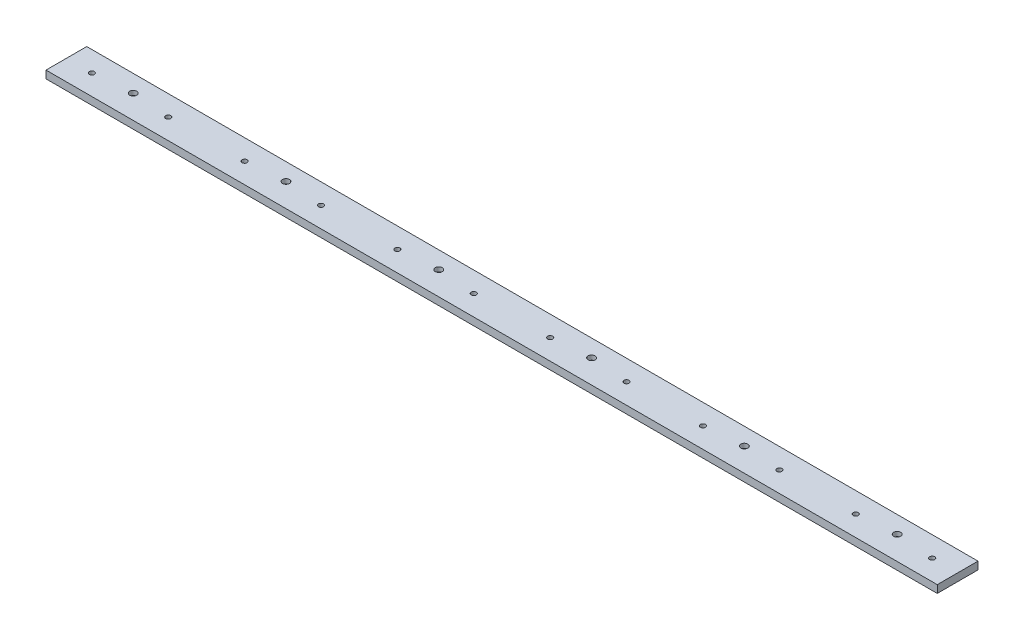
ISO-10303-21;
HEADER;
FILE_DESCRIPTION(('STEP AP214'),'2;1');
FILE_NAME('part.step','',(''),(''),'','','');
FILE_SCHEMA(('AUTOMOTIVE_DESIGN { 1 0 10303 214 1 1 1 1 }'));
ENDSEC;
DATA;
#1=APPLICATION_CONTEXT('core data for automotive mechanical design processes');
#2=APPLICATION_PROTOCOL_DEFINITION('international standard','automotive_design',2000,#1);
#3=PRODUCT_CONTEXT('',#1,'mechanical');
#4=PRODUCT('Part','Part','',(#3));
#5=PRODUCT_RELATED_PRODUCT_CATEGORY('part','',(#4));
#6=PRODUCT_DEFINITION_FORMATION('','',#4);
#7=PRODUCT_DEFINITION_CONTEXT('part definition',#1,'design');
#8=PRODUCT_DEFINITION('design','',#6,#7);
#9=PRODUCT_DEFINITION_SHAPE('','',#8);
#10=(LENGTH_UNIT() NAMED_UNIT(*) SI_UNIT(.MILLI.,.METRE.));
#11=(NAMED_UNIT(*) PLANE_ANGLE_UNIT() SI_UNIT($,.RADIAN.));
#12=(NAMED_UNIT(*) SI_UNIT($,.STERADIAN.) SOLID_ANGLE_UNIT());
#13=UNCERTAINTY_MEASURE_WITH_UNIT(LENGTH_MEASURE(1.E-05),#10,'distance_accuracy_value','');
#14=(GEOMETRIC_REPRESENTATION_CONTEXT(3) GLOBAL_UNCERTAINTY_ASSIGNED_CONTEXT((#13)) GLOBAL_UNIT_ASSIGNED_CONTEXT((#10,
#11,#12)) REPRESENTATION_CONTEXT('',''));
#15=CARTESIAN_POINT('',(0.,0.,0.));
#16=DIRECTION('',(0.,0.,1.));
#17=DIRECTION('',(1.,0.,0.));
#18=AXIS2_PLACEMENT_3D('',#15,#16,#17);
#19=CARTESIAN_POINT('',(50.,0.0325000000884756,13.5));
#20=DIRECTION('',(0.,-1.,0.));
#21=DIRECTION('',(0.,0.,-1.));
#22=AXIS2_PLACEMENT_3D('',#19,#20,#21);
#23=CONICAL_SURFACE('',#22,5.19999999989977,0.785398163409049);
#24=CARTESIAN_POINT('',(50.,2.4825,13.5));
#25=DIRECTION('',(0.,-1.,0.));
#26=DIRECTION('',(0.,0.,-1.));
#27=AXIS2_PLACEMENT_3D('',#24,#25,#26);
#28=CIRCLE('',#27,2.75);
#29=CARTESIAN_POINT('',(50.,2.4825,10.75));
#30=VERTEX_POINT('',#29);
#31=EDGE_CURVE('E331',#30,#30,#28,.F.);
#32=ORIENTED_EDGE('',*,*,#31,.T.);
#33=EDGE_LOOP('',(#32));
#34=FACE_BOUND('',#33,.T.);
#35=CARTESIAN_POINT('',(50.,0.0325000000429981,13.5));
#36=DIRECTION('',(0.,-1.,0.));
#37=DIRECTION('',(0.,0.,-1.));
#38=AXIS2_PLACEMENT_3D('',#35,#36,#37);
#39=CIRCLE('',#38,5.19999999994525);
#40=CARTESIAN_POINT('',(50.,0.0325000000429981,8.30000000005475));
#41=VERTEX_POINT('',#40);
#42=EDGE_CURVE('E19',#41,#41,#39,.F.);
#43=ORIENTED_EDGE('',*,*,#42,.F.);
#44=EDGE_LOOP('',(#43));
#45=FACE_BOUND('',#44,.T.);
#46=ADVANCED_FACE('F16',(#34,#45),#23,.F.);
#47=CARTESIAN_POINT('',(170.,0.0325000000884756,13.5));
#48=DIRECTION('',(0.,-1.,0.));
#49=DIRECTION('',(0.,0.,-1.));
#50=AXIS2_PLACEMENT_3D('',#47,#48,#49);
#51=CONICAL_SURFACE('',#50,5.19999999996115,0.785398163409049);
#52=CARTESIAN_POINT('',(170.,2.4825,13.5));
#53=DIRECTION('',(0.,-1.,0.));
#54=DIRECTION('',(0.,0.,-1.));
#55=AXIS2_PLACEMENT_3D('',#52,#53,#54);
#56=CIRCLE('',#55,2.75);
#57=CARTESIAN_POINT('',(170.,2.4825,10.75));
#58=VERTEX_POINT('',#57);
#59=EDGE_CURVE('E325',#58,#58,#56,.F.);
#60=ORIENTED_EDGE('',*,*,#59,.T.);
#61=EDGE_LOOP('',(#60));
#62=FACE_BOUND('',#61,.T.);
#63=CARTESIAN_POINT('',(170.,0.0325000000475362,13.5));
#64=DIRECTION('',(0.,-1.,0.));
#65=DIRECTION('',(0.,0.,-1.));
#66=AXIS2_PLACEMENT_3D('',#63,#64,#65);
#67=CIRCLE('',#66,5.20000000000209);
#68=CARTESIAN_POINT('',(170.,0.0325000000475362,8.29999999999791));
#69=VERTEX_POINT('',#68);
#70=EDGE_CURVE('E179',#69,#69,#67,.F.);
#71=ORIENTED_EDGE('',*,*,#70,.F.);
#72=EDGE_LOOP('',(#71));
#73=FACE_BOUND('',#72,.T.);
#74=ADVANCED_FACE('F188',(#62,#73),#51,.F.);
#75=CARTESIAN_POINT('',(290.,0.0325000001453191,13.5));
#76=DIRECTION('',(0.,-1.,0.));
#77=DIRECTION('',(0.,0.,-1.));
#78=AXIS2_PLACEMENT_3D('',#75,#76,#77);
#79=CONICAL_SURFACE('',#78,5.19999999985204,0.785398163397448);
#80=CARTESIAN_POINT('',(290.,2.4825,13.5));
#81=DIRECTION('',(0.,-1.,0.));
#82=DIRECTION('',(0.,0.,-1.));
#83=AXIS2_PLACEMENT_3D('',#80,#81,#82);
#84=CIRCLE('',#83,2.75);
#85=CARTESIAN_POINT('',(290.,2.4825,10.75));
#86=VERTEX_POINT('',#85);
#87=EDGE_CURVE('E311',#86,#86,#84,.F.);
#88=ORIENTED_EDGE('',*,*,#87,.T.);
#89=EDGE_LOOP('',(#88));
#90=FACE_BOUND('',#89,.T.);
#91=CARTESIAN_POINT('',(290.,0.0325000000521158,13.5));
#92=DIRECTION('',(0.,-1.,0.));
#93=DIRECTION('',(0.,0.,-1.));
#94=AXIS2_PLACEMENT_3D('',#91,#92,#93);
#95=CIRCLE('',#94,5.19999999994525);
#96=CARTESIAN_POINT('',(290.,0.0325000000521158,8.30000000005475));
#97=VERTEX_POINT('',#96);
#98=EDGE_CURVE('E177',#97,#97,#95,.F.);
#99=ORIENTED_EDGE('',*,*,#98,.F.);
#100=EDGE_LOOP('',(#99));
#101=FACE_BOUND('',#100,.T.);
#102=ADVANCED_FACE('F194',(#90,#101),#79,.F.);
#103=CARTESIAN_POINT('',(410.,0.0325000000316322,13.5));
#104=DIRECTION('',(0.,-1.,0.));
#105=DIRECTION('',(0.,0.,-1.));
#106=AXIS2_PLACEMENT_3D('',#103,#104,#105);
#107=CONICAL_SURFACE('',#106,5.19999999991339,0.785398163397448);
#108=CARTESIAN_POINT('',(410.,2.4825,13.5));
#109=DIRECTION('',(0.,-1.,0.));
#110=DIRECTION('',(0.,0.,-1.));
#111=AXIS2_PLACEMENT_3D('',#108,#109,#110);
#112=CIRCLE('',#111,2.75);
#113=CARTESIAN_POINT('',(410.,2.4825,10.75));
#114=VERTEX_POINT('',#113);
#115=EDGE_CURVE('E324',#114,#114,#112,.F.);
#116=ORIENTED_EDGE('',*,*,#115,.T.);
#117=EDGE_LOOP('',(#116));
#118=FACE_BOUND('',#117,.T.);
#119=CARTESIAN_POINT('',(410.,0.0324999999429254,13.5));
#120=DIRECTION('',(0.,-1.,0.));
#121=DIRECTION('',(0.,0.,-1.));
#122=AXIS2_PLACEMENT_3D('',#119,#120,#121);
#123=CIRCLE('',#122,5.20000000000209);
#124=CARTESIAN_POINT('',(410.,0.0324999999429254,8.29999999999791));
#125=VERTEX_POINT('',#124);
#126=EDGE_CURVE('E174',#125,#125,#123,.F.);
#127=ORIENTED_EDGE('',*,*,#126,.F.);
#128=EDGE_LOOP('',(#127));
#129=FACE_BOUND('',#128,.T.);
#130=ADVANCED_FACE('F299',(#118,#129),#107,.F.);
#131=CARTESIAN_POINT('',(530.,0.0325000000884756,13.5));
#132=DIRECTION('',(0.,-1.,0.));
#133=DIRECTION('',(0.,0.,-1.));
#134=AXIS2_PLACEMENT_3D('',#131,#132,#133);
#135=CONICAL_SURFACE('',#134,5.19999999997478,0.785398163397448);
#136=CARTESIAN_POINT('',(530.,2.4825,13.5));
#137=DIRECTION('',(0.,-1.,0.));
#138=DIRECTION('',(0.,0.,-1.));
#139=AXIS2_PLACEMENT_3D('',#136,#137,#138);
#140=CIRCLE('',#139,2.75);
#141=CARTESIAN_POINT('',(530.,2.4825,10.75));
#142=VERTEX_POINT('',#141);
#143=EDGE_CURVE('E328',#142,#142,#140,.F.);
#144=ORIENTED_EDGE('',*,*,#143,.T.);
#145=EDGE_LOOP('',(#144));
#146=FACE_BOUND('',#145,.T.);
#147=CARTESIAN_POINT('',(530.,0.0325000000043207,13.5));
#148=DIRECTION('',(0.,-1.,0.));
#149=DIRECTION('',(0.,0.,-1.));
#150=AXIS2_PLACEMENT_3D('',#147,#148,#149);
#151=CIRCLE('',#150,5.20000000005894);
#152=CARTESIAN_POINT('',(530.,0.0325000000043207,8.29999999994106));
#153=VERTEX_POINT('',#152);
#154=EDGE_CURVE('E171',#153,#153,#151,.F.);
#155=ORIENTED_EDGE('',*,*,#154,.F.);
#156=EDGE_LOOP('',(#155));
#157=FACE_BOUND('',#156,.T.);
#158=ADVANCED_FACE('F295',(#146,#157),#135,.F.);
#159=CARTESIAN_POINT('',(650.,0.0325000000316322,13.5));
#160=DIRECTION('',(0.,-1.,0.));
#161=DIRECTION('',(0.,0.,-1.));
#162=AXIS2_PLACEMENT_3D('',#159,#160,#161);
#163=CONICAL_SURFACE('',#162,5.19999999997933,0.785398163397448);
#164=CARTESIAN_POINT('',(650.,2.4825,13.5));
#165=DIRECTION('',(0.,-1.,0.));
#166=DIRECTION('',(0.,0.,-1.));
#167=AXIS2_PLACEMENT_3D('',#164,#165,#166);
#168=CIRCLE('',#167,2.75);
#169=CARTESIAN_POINT('',(650.,2.4825,10.75));
#170=VERTEX_POINT('',#169);
#171=EDGE_CURVE('E168',#170,#170,#168,.F.);
#172=ORIENTED_EDGE('',*,*,#171,.T.);
#173=EDGE_LOOP('',(#172));
#174=FACE_BOUND('',#173,.T.);
#175=CARTESIAN_POINT('',(650.,0.0325000000088727,13.5));
#176=DIRECTION('',(0.,-1.,0.));
#177=DIRECTION('',(0.,0.,-1.));
#178=AXIS2_PLACEMENT_3D('',#175,#176,#177);
#179=CIRCLE('',#178,5.20000000000209);
#180=CARTESIAN_POINT('',(650.,0.0325000000088727,8.29999999999791));
#181=VERTEX_POINT('',#180);
#182=EDGE_CURVE('E66',#181,#181,#179,.F.);
#183=ORIENTED_EDGE('',*,*,#182,.F.);
#184=EDGE_LOOP('',(#183));
#185=FACE_BOUND('',#184,.T.);
#186=ADVANCED_FACE('F291',(#174,#185),#163,.F.);
#187=CARTESIAN_POINT('',(0.,0.03250000000003,0.));
#188=DIRECTION('',(0.,-1.,0.));
#189=DIRECTION('',(0.,0.,-1.));
#190=AXIS2_PLACEMENT_3D('',#187,#188,#189);
#191=PLANE('',#190);
#192=CARTESIAN_POINT('',(680.,0.0325000000000299,16.));
#193=DIRECTION('',(0.,-1.,0.));
#194=DIRECTION('',(0.,0.,-1.));
#195=AXIS2_PLACEMENT_3D('',#192,#193,#194);
#196=CIRCLE('',#195,2.);
#197=CARTESIAN_POINT('',(680.,0.0325000000000299,14.));
#198=VERTEX_POINT('',#197);
#199=EDGE_CURVE('E132',#198,#198,#196,.F.);
#200=ORIENTED_EDGE('',*,*,#199,.T.);
#201=EDGE_LOOP('',(#200));
#202=FACE_BOUND('',#201,.T.);
#203=CARTESIAN_POINT('',(620.,0.0325000000000299,16.));
#204=DIRECTION('',(0.,-1.,0.));
#205=DIRECTION('',(0.,0.,-1.));
#206=AXIS2_PLACEMENT_3D('',#203,#204,#205);
#207=CIRCLE('',#206,2.);
#208=CARTESIAN_POINT('',(620.,0.0325000000000299,14.));
#209=VERTEX_POINT('',#208);
#210=EDGE_CURVE('E135',#209,#209,#207,.F.);
#211=ORIENTED_EDGE('',*,*,#210,.T.);
#212=EDGE_LOOP('',(#211));
#213=FACE_BOUND('',#212,.T.);
#214=CARTESIAN_POINT('',(560.,0.0325000000000299,16.));
#215=DIRECTION('',(0.,-1.,0.));
#216=DIRECTION('',(0.,0.,-1.));
#217=AXIS2_PLACEMENT_3D('',#214,#215,#216);
#218=CIRCLE('',#217,2.);
#219=CARTESIAN_POINT('',(560.,0.0325000000000299,14.));
#220=VERTEX_POINT('',#219);
#221=EDGE_CURVE('E138',#220,#220,#218,.F.);
#222=ORIENTED_EDGE('',*,*,#221,.T.);
#223=EDGE_LOOP('',(#222));
#224=FACE_BOUND('',#223,.T.);
#225=ORIENTED_EDGE('',*,*,#182,.T.);
#226=EDGE_LOOP('',(#225));
#227=FACE_BOUND('',#226,.T.);
#228=ORIENTED_EDGE('',*,*,#154,.T.);
#229=EDGE_LOOP('',(#228));
#230=FACE_BOUND('',#229,.T.);
#231=CARTESIAN_POINT('',(500.,0.0325000000000299,16.));
#232=DIRECTION('',(0.,-1.,0.));
#233=DIRECTION('',(0.,0.,-1.));
#234=AXIS2_PLACEMENT_3D('',#231,#232,#233);
#235=CIRCLE('',#234,2.);
#236=CARTESIAN_POINT('',(500.,0.0325000000000299,14.));
#237=VERTEX_POINT('',#236);
#238=EDGE_CURVE('E141',#237,#237,#235,.F.);
#239=ORIENTED_EDGE('',*,*,#238,.T.);
#240=EDGE_LOOP('',(#239));
#241=FACE_BOUND('',#240,.T.);
#242=CARTESIAN_POINT('',(440.,0.0325000000000299,16.));
#243=DIRECTION('',(0.,-1.,0.));
#244=DIRECTION('',(0.,0.,-1.));
#245=AXIS2_PLACEMENT_3D('',#242,#243,#244);
#246=CIRCLE('',#245,2.);
#247=CARTESIAN_POINT('',(440.,0.0325000000000299,14.));
#248=VERTEX_POINT('',#247);
#249=EDGE_CURVE('E144',#248,#248,#246,.F.);
#250=ORIENTED_EDGE('',*,*,#249,.T.);
#251=EDGE_LOOP('',(#250));
#252=FACE_BOUND('',#251,.T.);
#253=CARTESIAN_POINT('',(380.,0.0325000000000299,16.));
#254=DIRECTION('',(0.,-1.,0.));
#255=DIRECTION('',(0.,0.,-1.));
#256=AXIS2_PLACEMENT_3D('',#253,#254,#255);
#257=CIRCLE('',#256,2.);
#258=CARTESIAN_POINT('',(380.,0.0325000000000299,14.));
#259=VERTEX_POINT('',#258);
#260=EDGE_CURVE('E147',#259,#259,#257,.F.);
#261=ORIENTED_EDGE('',*,*,#260,.T.);
#262=EDGE_LOOP('',(#261));
#263=FACE_BOUND('',#262,.T.);
#264=ORIENTED_EDGE('',*,*,#126,.T.);
#265=EDGE_LOOP('',(#264));
#266=FACE_BOUND('',#265,.T.);
#267=CARTESIAN_POINT('',(320.,0.0325000000000299,16.));
#268=DIRECTION('',(0.,-1.,0.));
#269=DIRECTION('',(0.,0.,-1.));
#270=AXIS2_PLACEMENT_3D('',#267,#268,#269);
#271=CIRCLE('',#270,2.);
#272=CARTESIAN_POINT('',(320.,0.0325000000000299,14.));
#273=VERTEX_POINT('',#272);
#274=EDGE_CURVE('E150',#273,#273,#271,.F.);
#275=ORIENTED_EDGE('',*,*,#274,.T.);
#276=EDGE_LOOP('',(#275));
#277=FACE_BOUND('',#276,.T.);
#278=CARTESIAN_POINT('',(260.,0.0325000000000299,16.));
#279=DIRECTION('',(0.,-1.,0.));
#280=DIRECTION('',(0.,0.,-1.));
#281=AXIS2_PLACEMENT_3D('',#278,#279,#280);
#282=CIRCLE('',#281,2.);
#283=CARTESIAN_POINT('',(260.,0.0325000000000299,14.));
#284=VERTEX_POINT('',#283);
#285=EDGE_CURVE('E153',#284,#284,#282,.F.);
#286=ORIENTED_EDGE('',*,*,#285,.T.);
#287=EDGE_LOOP('',(#286));
#288=FACE_BOUND('',#287,.T.);
#289=CARTESIAN_POINT('',(200.,0.0325000000000299,16.));
#290=DIRECTION('',(0.,-1.,0.));
#291=DIRECTION('',(0.,0.,-1.));
#292=AXIS2_PLACEMENT_3D('',#289,#290,#291);
#293=CIRCLE('',#292,2.);
#294=CARTESIAN_POINT('',(200.,0.0325000000000299,14.));
#295=VERTEX_POINT('',#294);
#296=EDGE_CURVE('E156',#295,#295,#293,.F.);
#297=ORIENTED_EDGE('',*,*,#296,.T.);
#298=EDGE_LOOP('',(#297));
#299=FACE_BOUND('',#298,.T.);
#300=ORIENTED_EDGE('',*,*,#98,.T.);
#301=EDGE_LOOP('',(#300));
#302=FACE_BOUND('',#301,.T.);
#303=CARTESIAN_POINT('',(140.,0.0325000000000299,16.));
#304=DIRECTION('',(0.,-1.,0.));
#305=DIRECTION('',(0.,0.,-1.));
#306=AXIS2_PLACEMENT_3D('',#303,#304,#305);
#307=CIRCLE('',#306,2.);
#308=CARTESIAN_POINT('',(140.,0.0325000000000299,14.));
#309=VERTEX_POINT('',#308);
#310=EDGE_CURVE('E159',#309,#309,#307,.F.);
#311=ORIENTED_EDGE('',*,*,#310,.T.);
#312=EDGE_LOOP('',(#311));
#313=FACE_BOUND('',#312,.T.);
#314=CARTESIAN_POINT('',(80.,0.0325000000000299,16.));
#315=DIRECTION('',(0.,-1.,0.));
#316=DIRECTION('',(0.,0.,-1.));
#317=AXIS2_PLACEMENT_3D('',#314,#315,#316);
#318=CIRCLE('',#317,2.);
#319=CARTESIAN_POINT('',(80.,0.0325000000000299,14.));
#320=VERTEX_POINT('',#319);
#321=EDGE_CURVE('E162',#320,#320,#318,.F.);
#322=ORIENTED_EDGE('',*,*,#321,.T.);
#323=EDGE_LOOP('',(#322));
#324=FACE_BOUND('',#323,.T.);
#325=CARTESIAN_POINT('',(20.,0.0325000000000299,16.));
#326=DIRECTION('',(0.,-1.,0.));
#327=DIRECTION('',(0.,0.,-1.));
#328=AXIS2_PLACEMENT_3D('',#325,#326,#327);
#329=CIRCLE('',#328,2.);
#330=CARTESIAN_POINT('',(20.,0.0325000000000299,14.));
#331=VERTEX_POINT('',#330);
#332=EDGE_CURVE('E165',#331,#331,#329,.F.);
#333=ORIENTED_EDGE('',*,*,#332,.T.);
#334=EDGE_LOOP('',(#333));
#335=FACE_BOUND('',#334,.T.);
#336=ORIENTED_EDGE('',*,*,#70,.T.);
#337=EDGE_LOOP('',(#336));
#338=FACE_BOUND('',#337,.T.);
#339=ORIENTED_EDGE('',*,*,#42,.T.);
#340=EDGE_LOOP('',(#339));
#341=FACE_BOUND('',#340,.T.);
#342=DIRECTION('',(0.,0.,-1.));
#343=VECTOR('',#342,1.);
#344=CARTESIAN_POINT('',(700.,0.0325000000000299,0.));
#345=LINE('',#344,#343);
#346=CARTESIAN_POINT('',(700.,0.0325000000000299,32.));
#347=VERTEX_POINT('',#346);
#348=CARTESIAN_POINT('',(700.,0.0325000000000299,0.));
#349=VERTEX_POINT('',#348);
#350=EDGE_CURVE('E340',#347,#349,#345,.T.);
#351=ORIENTED_EDGE('',*,*,#350,.F.);
#352=DIRECTION('',(1.,0.,0.));
#353=VECTOR('',#352,1.);
#354=CARTESIAN_POINT('',(0.,0.0325000000000299,32.));
#355=LINE('',#354,#353);
#356=CARTESIAN_POINT('',(0.,0.0325000000000299,32.));
#357=VERTEX_POINT('',#356);
#358=EDGE_CURVE('E60',#357,#347,#355,.T.);
#359=ORIENTED_EDGE('',*,*,#358,.F.);
#360=DIRECTION('',(0.,0.,-1.));
#361=VECTOR('',#360,1.);
#362=CARTESIAN_POINT('',(0.,0.0325000000000299,0.));
#363=LINE('',#362,#361);
#364=CARTESIAN_POINT('',(0.,0.0325000000000299,0.));
#365=VERTEX_POINT('',#364);
#366=EDGE_CURVE('E58',#357,#365,#363,.T.);
#367=ORIENTED_EDGE('',*,*,#366,.T.);
#368=DIRECTION('',(1.,0.,0.));
#369=VECTOR('',#368,1.);
#370=CARTESIAN_POINT('',(0.,0.0325000000000299,0.));
#371=LINE('',#370,#369);
#372=EDGE_CURVE('E55',#365,#349,#371,.T.);
#373=ORIENTED_EDGE('',*,*,#372,.T.);
#374=EDGE_LOOP('',(#351,#359,#367,#373));
#375=FACE_BOUND('',#374,.T.);
#376=ADVANCED_FACE('F59',(#202,#213,#224,#227,#230,#241,#252,#263,#266,#277,#288,#299,#302,#313,
#324,#335,#338,#341,#375),#191,.T.);
#377=CARTESIAN_POINT('',(0.,6.0325,0.));
#378=DIRECTION('',(1.,0.,0.));
#379=DIRECTION('',(0.,0.,-1.));
#380=AXIS2_PLACEMENT_3D('',#377,#378,#379);
#381=PLANE('',#380);
#382=DIRECTION('',(0.,1.,0.));
#383=VECTOR('',#382,1.);
#384=CARTESIAN_POINT('',(0.,6.0325,32.));
#385=LINE('',#384,#383);
#386=CARTESIAN_POINT('',(0.,6.0325,32.));
#387=VERTEX_POINT('',#386);
#388=EDGE_CURVE('E338',#387,#357,#385,.F.);
#389=ORIENTED_EDGE('',*,*,#388,.F.);
#390=DIRECTION('',(0.,0.,-1.));
#391=VECTOR('',#390,1.);
#392=CARTESIAN_POINT('',(0.,6.0325,0.));
#393=LINE('',#392,#391);
#394=CARTESIAN_POINT('',(0.,6.0325,0.));
#395=VERTEX_POINT('',#394);
#396=EDGE_CURVE('E77',#387,#395,#393,.T.);
#397=ORIENTED_EDGE('',*,*,#396,.T.);
#398=DIRECTION('',(0.,1.,0.));
#399=VECTOR('',#398,1.);
#400=CARTESIAN_POINT('',(0.,6.0325,0.));
#401=LINE('',#400,#399);
#402=EDGE_CURVE('E65',#395,#365,#401,.F.);
#403=ORIENTED_EDGE('',*,*,#402,.T.);
#404=ORIENTED_EDGE('',*,*,#366,.F.);
#405=EDGE_LOOP('',(#389,#397,#403,#404));
#406=FACE_BOUND('',#405,.T.);
#407=ADVANCED_FACE('F76',(#406),#381,.F.);
#408=CARTESIAN_POINT('',(0.,6.0325,0.));
#409=DIRECTION('',(0.,0.,1.));
#410=DIRECTION('',(1.,0.,0.));
#411=AXIS2_PLACEMENT_3D('',#408,#409,#410);
#412=PLANE('',#411);
#413=ORIENTED_EDGE('',*,*,#372,.F.);
#414=ORIENTED_EDGE('',*,*,#402,.F.);
#415=DIRECTION('',(1.,0.,0.));
#416=VECTOR('',#415,1.);
#417=CARTESIAN_POINT('',(0.,6.0325,0.));
#418=LINE('',#417,#416);
#419=CARTESIAN_POINT('',(700.,6.0325,0.));
#420=VERTEX_POINT('',#419);
#421=EDGE_CURVE('E345',#395,#420,#418,.T.);
#422=ORIENTED_EDGE('',*,*,#421,.T.);
#423=DIRECTION('',(0.,1.,0.));
#424=VECTOR('',#423,1.);
#425=CARTESIAN_POINT('',(700.,6.0325,0.));
#426=LINE('',#425,#424);
#427=EDGE_CURVE('E73',#349,#420,#426,.T.);
#428=ORIENTED_EDGE('',*,*,#427,.F.);
#429=EDGE_LOOP('',(#413,#414,#422,#428));
#430=FACE_BOUND('',#429,.T.);
#431=ADVANCED_FACE('F70',(#430),#412,.F.);
#432=CARTESIAN_POINT('',(700.,6.0325,0.));
#433=DIRECTION('',(1.,0.,0.));
#434=DIRECTION('',(0.,0.,-1.));
#435=AXIS2_PLACEMENT_3D('',#432,#433,#434);
#436=PLANE('',#435);
#437=DIRECTION('',(0.,1.,0.));
#438=VECTOR('',#437,1.);
#439=CARTESIAN_POINT('',(700.,6.0325,32.));
#440=LINE('',#439,#438);
#441=CARTESIAN_POINT('',(700.,6.0325,32.));
#442=VERTEX_POINT('',#441);
#443=EDGE_CURVE('E34',#347,#442,#440,.T.);
#444=ORIENTED_EDGE('',*,*,#443,.F.);
#445=ORIENTED_EDGE('',*,*,#350,.T.);
#446=ORIENTED_EDGE('',*,*,#427,.T.);
#447=DIRECTION('',(0.,0.,-1.));
#448=VECTOR('',#447,1.);
#449=CARTESIAN_POINT('',(700.,6.0325,0.));
#450=LINE('',#449,#448);
#451=EDGE_CURVE('E343',#420,#442,#450,.F.);
#452=ORIENTED_EDGE('',*,*,#451,.T.);
#453=EDGE_LOOP('',(#444,#445,#446,#452));
#454=FACE_BOUND('',#453,.T.);
#455=ADVANCED_FACE('F281',(#454),#436,.T.);
#456=CARTESIAN_POINT('',(0.,6.0325,32.));
#457=DIRECTION('',(0.,0.,1.));
#458=DIRECTION('',(1.,0.,0.));
#459=AXIS2_PLACEMENT_3D('',#456,#457,#458);
#460=PLANE('',#459);
#461=ORIENTED_EDGE('',*,*,#358,.T.);
#462=ORIENTED_EDGE('',*,*,#443,.T.);
#463=DIRECTION('',(1.,0.,0.));
#464=VECTOR('',#463,1.);
#465=CARTESIAN_POINT('',(0.,6.0325,32.));
#466=LINE('',#465,#464);
#467=EDGE_CURVE('E131',#442,#387,#466,.F.);
#468=ORIENTED_EDGE('',*,*,#467,.T.);
#469=ORIENTED_EDGE('',*,*,#388,.T.);
#470=EDGE_LOOP('',(#461,#462,#468,#469));
#471=FACE_BOUND('',#470,.T.);
#472=ADVANCED_FACE('F277',(#471),#460,.T.);
#473=CARTESIAN_POINT('',(50.,6.0325,13.5));
#474=DIRECTION('',(0.,-1.,0.));
#475=DIRECTION('',(0.,0.,-1.));
#476=AXIS2_PLACEMENT_3D('',#473,#474,#475);
#477=CYLINDRICAL_SURFACE('',#476,2.75);
#478=CARTESIAN_POINT('',(50.,6.0325,13.5));
#479=DIRECTION('',(0.,-1.,0.));
#480=DIRECTION('',(0.,0.,-1.));
#481=AXIS2_PLACEMENT_3D('',#478,#479,#480);
#482=CIRCLE('',#481,2.75);
#483=CARTESIAN_POINT('',(50.,6.0325,10.75));
#484=VERTEX_POINT('',#483);
#485=EDGE_CURVE('E128',#484,#484,#482,.F.);
#486=ORIENTED_EDGE('',*,*,#485,.T.);
#487=EDGE_LOOP('',(#486));
#488=FACE_BOUND('',#487,.T.);
#489=ORIENTED_EDGE('',*,*,#31,.F.);
#490=EDGE_LOOP('',(#489));
#491=FACE_BOUND('',#490,.T.);
#492=ADVANCED_FACE('F273',(#488,#491),#477,.F.);
#493=CARTESIAN_POINT('',(170.,6.0325,13.5));
#494=DIRECTION('',(0.,-1.,0.));
#495=DIRECTION('',(0.,0.,-1.));
#496=AXIS2_PLACEMENT_3D('',#493,#494,#495);
#497=CYLINDRICAL_SURFACE('',#496,2.75);
#498=CARTESIAN_POINT('',(170.,6.0325,13.5));
#499=DIRECTION('',(0.,-1.,0.));
#500=DIRECTION('',(0.,0.,-1.));
#501=AXIS2_PLACEMENT_3D('',#498,#499,#500);
#502=CIRCLE('',#501,2.75);
#503=CARTESIAN_POINT('',(170.,6.0325,10.75));
#504=VERTEX_POINT('',#503);
#505=EDGE_CURVE('E125',#504,#504,#502,.F.);
#506=ORIENTED_EDGE('',*,*,#505,.T.);
#507=EDGE_LOOP('',(#506));
#508=FACE_BOUND('',#507,.T.);
#509=ORIENTED_EDGE('',*,*,#59,.F.);
#510=EDGE_LOOP('',(#509));
#511=FACE_BOUND('',#510,.T.);
#512=ADVANCED_FACE('F269',(#508,#511),#497,.F.);
#513=CARTESIAN_POINT('',(290.,6.0325,13.5));
#514=DIRECTION('',(0.,-1.,0.));
#515=DIRECTION('',(0.,0.,-1.));
#516=AXIS2_PLACEMENT_3D('',#513,#514,#515);
#517=CYLINDRICAL_SURFACE('',#516,2.75);
#518=CARTESIAN_POINT('',(290.,6.0325,13.5));
#519=DIRECTION('',(0.,-1.,0.));
#520=DIRECTION('',(0.,0.,-1.));
#521=AXIS2_PLACEMENT_3D('',#518,#519,#520);
#522=CIRCLE('',#521,2.75);
#523=CARTESIAN_POINT('',(290.,6.0325,10.75));
#524=VERTEX_POINT('',#523);
#525=EDGE_CURVE('E122',#524,#524,#522,.F.);
#526=ORIENTED_EDGE('',*,*,#525,.T.);
#527=EDGE_LOOP('',(#526));
#528=FACE_BOUND('',#527,.T.);
#529=ORIENTED_EDGE('',*,*,#87,.F.);
#530=EDGE_LOOP('',(#529));
#531=FACE_BOUND('',#530,.T.);
#532=ADVANCED_FACE('F265',(#528,#531),#517,.F.);
#533=CARTESIAN_POINT('',(410.,6.0325,13.5));
#534=DIRECTION('',(0.,-1.,0.));
#535=DIRECTION('',(0.,0.,-1.));
#536=AXIS2_PLACEMENT_3D('',#533,#534,#535);
#537=CYLINDRICAL_SURFACE('',#536,2.75);
#538=CARTESIAN_POINT('',(410.,6.0325,13.5));
#539=DIRECTION('',(0.,-1.,0.));
#540=DIRECTION('',(0.,0.,-1.));
#541=AXIS2_PLACEMENT_3D('',#538,#539,#540);
#542=CIRCLE('',#541,2.75);
#543=CARTESIAN_POINT('',(410.,6.0325,10.75));
#544=VERTEX_POINT('',#543);
#545=EDGE_CURVE('E119',#544,#544,#542,.F.);
#546=ORIENTED_EDGE('',*,*,#545,.T.);
#547=EDGE_LOOP('',(#546));
#548=FACE_BOUND('',#547,.T.);
#549=ORIENTED_EDGE('',*,*,#115,.F.);
#550=EDGE_LOOP('',(#549));
#551=FACE_BOUND('',#550,.T.);
#552=ADVANCED_FACE('F261',(#548,#551),#537,.F.);
#553=CARTESIAN_POINT('',(530.,6.0325,13.5));
#554=DIRECTION('',(0.,-1.,0.));
#555=DIRECTION('',(0.,0.,-1.));
#556=AXIS2_PLACEMENT_3D('',#553,#554,#555);
#557=CYLINDRICAL_SURFACE('',#556,2.75);
#558=CARTESIAN_POINT('',(530.,6.0325,13.5));
#559=DIRECTION('',(0.,-1.,0.));
#560=DIRECTION('',(0.,0.,-1.));
#561=AXIS2_PLACEMENT_3D('',#558,#559,#560);
#562=CIRCLE('',#561,2.75);
#563=CARTESIAN_POINT('',(530.,6.0325,10.75));
#564=VERTEX_POINT('',#563);
#565=EDGE_CURVE('E116',#564,#564,#562,.F.);
#566=ORIENTED_EDGE('',*,*,#565,.T.);
#567=EDGE_LOOP('',(#566));
#568=FACE_BOUND('',#567,.T.);
#569=ORIENTED_EDGE('',*,*,#143,.F.);
#570=EDGE_LOOP('',(#569));
#571=FACE_BOUND('',#570,.T.);
#572=ADVANCED_FACE('F257',(#568,#571),#557,.F.);
#573=CARTESIAN_POINT('',(650.,6.0325,13.5));
#574=DIRECTION('',(0.,-1.,0.));
#575=DIRECTION('',(0.,0.,-1.));
#576=AXIS2_PLACEMENT_3D('',#573,#574,#575);
#577=CYLINDRICAL_SURFACE('',#576,2.75);
#578=CARTESIAN_POINT('',(650.,6.0325,13.5));
#579=DIRECTION('',(0.,-1.,0.));
#580=DIRECTION('',(0.,0.,-1.));
#581=AXIS2_PLACEMENT_3D('',#578,#579,#580);
#582=CIRCLE('',#581,2.75);
#583=CARTESIAN_POINT('',(650.,6.0325,10.75));
#584=VERTEX_POINT('',#583);
#585=EDGE_CURVE('E113',#584,#584,#582,.F.);
#586=ORIENTED_EDGE('',*,*,#585,.T.);
#587=EDGE_LOOP('',(#586));
#588=FACE_BOUND('',#587,.T.);
#589=ORIENTED_EDGE('',*,*,#171,.F.);
#590=EDGE_LOOP('',(#589));
#591=FACE_BOUND('',#590,.T.);
#592=ADVANCED_FACE('F253',(#588,#591),#577,.F.);
#593=CARTESIAN_POINT('',(20.,6.0325,16.));
#594=DIRECTION('',(0.,-1.,0.));
#595=DIRECTION('',(0.,0.,-1.));
#596=AXIS2_PLACEMENT_3D('',#593,#594,#595);
#597=CYLINDRICAL_SURFACE('',#596,2.);
#598=CARTESIAN_POINT('',(20.,6.0325,16.));
#599=DIRECTION('',(0.,-1.,0.));
#600=DIRECTION('',(0.,0.,-1.));
#601=AXIS2_PLACEMENT_3D('',#598,#599,#600);
#602=CIRCLE('',#601,2.);
#603=CARTESIAN_POINT('',(20.,6.0325,14.));
#604=VERTEX_POINT('',#603);
#605=EDGE_CURVE('E110',#604,#604,#602,.F.);
#606=ORIENTED_EDGE('',*,*,#605,.T.);
#607=EDGE_LOOP('',(#606));
#608=FACE_BOUND('',#607,.T.);
#609=ORIENTED_EDGE('',*,*,#332,.F.);
#610=EDGE_LOOP('',(#609));
#611=FACE_BOUND('',#610,.T.);
#612=ADVANCED_FACE('F249',(#608,#611),#597,.F.);
#613=CARTESIAN_POINT('',(80.,6.0325,16.));
#614=DIRECTION('',(0.,-1.,0.));
#615=DIRECTION('',(0.,0.,-1.));
#616=AXIS2_PLACEMENT_3D('',#613,#614,#615);
#617=CYLINDRICAL_SURFACE('',#616,2.);
#618=CARTESIAN_POINT('',(80.,6.0325,16.));
#619=DIRECTION('',(0.,-1.,0.));
#620=DIRECTION('',(0.,0.,-1.));
#621=AXIS2_PLACEMENT_3D('',#618,#619,#620);
#622=CIRCLE('',#621,2.);
#623=CARTESIAN_POINT('',(80.,6.0325,14.));
#624=VERTEX_POINT('',#623);
#625=EDGE_CURVE('E107',#624,#624,#622,.F.);
#626=ORIENTED_EDGE('',*,*,#625,.T.);
#627=EDGE_LOOP('',(#626));
#628=FACE_BOUND('',#627,.T.);
#629=ORIENTED_EDGE('',*,*,#321,.F.);
#630=EDGE_LOOP('',(#629));
#631=FACE_BOUND('',#630,.T.);
#632=ADVANCED_FACE('F245',(#628,#631),#617,.F.);
#633=CARTESIAN_POINT('',(140.,6.0325,16.));
#634=DIRECTION('',(0.,-1.,0.));
#635=DIRECTION('',(0.,0.,-1.));
#636=AXIS2_PLACEMENT_3D('',#633,#634,#635);
#637=CYLINDRICAL_SURFACE('',#636,2.);
#638=CARTESIAN_POINT('',(140.,6.0325,16.));
#639=DIRECTION('',(0.,-1.,0.));
#640=DIRECTION('',(0.,0.,-1.));
#641=AXIS2_PLACEMENT_3D('',#638,#639,#640);
#642=CIRCLE('',#641,2.);
#643=CARTESIAN_POINT('',(140.,6.0325,14.));
#644=VERTEX_POINT('',#643);
#645=EDGE_CURVE('E104',#644,#644,#642,.F.);
#646=ORIENTED_EDGE('',*,*,#645,.T.);
#647=EDGE_LOOP('',(#646));
#648=FACE_BOUND('',#647,.T.);
#649=ORIENTED_EDGE('',*,*,#310,.F.);
#650=EDGE_LOOP('',(#649));
#651=FACE_BOUND('',#650,.T.);
#652=ADVANCED_FACE('F241',(#648,#651),#637,.F.);
#653=CARTESIAN_POINT('',(200.,6.0325,16.));
#654=DIRECTION('',(0.,-1.,0.));
#655=DIRECTION('',(0.,0.,-1.));
#656=AXIS2_PLACEMENT_3D('',#653,#654,#655);
#657=CYLINDRICAL_SURFACE('',#656,2.);
#658=CARTESIAN_POINT('',(200.,6.0325,16.));
#659=DIRECTION('',(0.,-1.,0.));
#660=DIRECTION('',(0.,0.,-1.));
#661=AXIS2_PLACEMENT_3D('',#658,#659,#660);
#662=CIRCLE('',#661,2.);
#663=CARTESIAN_POINT('',(200.,6.0325,14.));
#664=VERTEX_POINT('',#663);
#665=EDGE_CURVE('E101',#664,#664,#662,.F.);
#666=ORIENTED_EDGE('',*,*,#665,.T.);
#667=EDGE_LOOP('',(#666));
#668=FACE_BOUND('',#667,.T.);
#669=ORIENTED_EDGE('',*,*,#296,.F.);
#670=EDGE_LOOP('',(#669));
#671=FACE_BOUND('',#670,.T.);
#672=ADVANCED_FACE('F237',(#668,#671),#657,.F.);
#673=CARTESIAN_POINT('',(260.,6.0325,16.));
#674=DIRECTION('',(0.,-1.,0.));
#675=DIRECTION('',(0.,0.,-1.));
#676=AXIS2_PLACEMENT_3D('',#673,#674,#675);
#677=CYLINDRICAL_SURFACE('',#676,2.);
#678=CARTESIAN_POINT('',(260.,6.0325,16.));
#679=DIRECTION('',(0.,-1.,0.));
#680=DIRECTION('',(0.,0.,-1.));
#681=AXIS2_PLACEMENT_3D('',#678,#679,#680);
#682=CIRCLE('',#681,2.);
#683=CARTESIAN_POINT('',(260.,6.0325,14.));
#684=VERTEX_POINT('',#683);
#685=EDGE_CURVE('E98',#684,#684,#682,.F.);
#686=ORIENTED_EDGE('',*,*,#685,.T.);
#687=EDGE_LOOP('',(#686));
#688=FACE_BOUND('',#687,.T.);
#689=ORIENTED_EDGE('',*,*,#285,.F.);
#690=EDGE_LOOP('',(#689));
#691=FACE_BOUND('',#690,.T.);
#692=ADVANCED_FACE('F233',(#688,#691),#677,.F.);
#693=CARTESIAN_POINT('',(320.,6.0325,16.));
#694=DIRECTION('',(0.,-1.,0.));
#695=DIRECTION('',(0.,0.,-1.));
#696=AXIS2_PLACEMENT_3D('',#693,#694,#695);
#697=CYLINDRICAL_SURFACE('',#696,2.);
#698=CARTESIAN_POINT('',(320.,6.0325,16.));
#699=DIRECTION('',(0.,-1.,0.));
#700=DIRECTION('',(0.,0.,-1.));
#701=AXIS2_PLACEMENT_3D('',#698,#699,#700);
#702=CIRCLE('',#701,2.);
#703=CARTESIAN_POINT('',(320.,6.0325,14.));
#704=VERTEX_POINT('',#703);
#705=EDGE_CURVE('E95',#704,#704,#702,.F.);
#706=ORIENTED_EDGE('',*,*,#705,.T.);
#707=EDGE_LOOP('',(#706));
#708=FACE_BOUND('',#707,.T.);
#709=ORIENTED_EDGE('',*,*,#274,.F.);
#710=EDGE_LOOP('',(#709));
#711=FACE_BOUND('',#710,.T.);
#712=ADVANCED_FACE('F229',(#708,#711),#697,.F.);
#713=CARTESIAN_POINT('',(380.,6.0325,16.));
#714=DIRECTION('',(0.,-1.,0.));
#715=DIRECTION('',(0.,0.,-1.));
#716=AXIS2_PLACEMENT_3D('',#713,#714,#715);
#717=CYLINDRICAL_SURFACE('',#716,2.);
#718=CARTESIAN_POINT('',(380.,6.0325,16.));
#719=DIRECTION('',(0.,-1.,0.));
#720=DIRECTION('',(0.,0.,-1.));
#721=AXIS2_PLACEMENT_3D('',#718,#719,#720);
#722=CIRCLE('',#721,2.);
#723=CARTESIAN_POINT('',(380.,6.0325,14.));
#724=VERTEX_POINT('',#723);
#725=EDGE_CURVE('E92',#724,#724,#722,.F.);
#726=ORIENTED_EDGE('',*,*,#725,.T.);
#727=EDGE_LOOP('',(#726));
#728=FACE_BOUND('',#727,.T.);
#729=ORIENTED_EDGE('',*,*,#260,.F.);
#730=EDGE_LOOP('',(#729));
#731=FACE_BOUND('',#730,.T.);
#732=ADVANCED_FACE('F225',(#728,#731),#717,.F.);
#733=CARTESIAN_POINT('',(440.,6.0325,16.));
#734=DIRECTION('',(0.,-1.,0.));
#735=DIRECTION('',(0.,0.,-1.));
#736=AXIS2_PLACEMENT_3D('',#733,#734,#735);
#737=CYLINDRICAL_SURFACE('',#736,2.);
#738=CARTESIAN_POINT('',(440.,6.0325,16.));
#739=DIRECTION('',(0.,-1.,0.));
#740=DIRECTION('',(0.,0.,-1.));
#741=AXIS2_PLACEMENT_3D('',#738,#739,#740);
#742=CIRCLE('',#741,2.);
#743=CARTESIAN_POINT('',(440.,6.0325,14.));
#744=VERTEX_POINT('',#743);
#745=EDGE_CURVE('E89',#744,#744,#742,.F.);
#746=ORIENTED_EDGE('',*,*,#745,.T.);
#747=EDGE_LOOP('',(#746));
#748=FACE_BOUND('',#747,.T.);
#749=ORIENTED_EDGE('',*,*,#249,.F.);
#750=EDGE_LOOP('',(#749));
#751=FACE_BOUND('',#750,.T.);
#752=ADVANCED_FACE('F221',(#748,#751),#737,.F.);
#753=CARTESIAN_POINT('',(500.,6.0325,16.));
#754=DIRECTION('',(0.,-1.,0.));
#755=DIRECTION('',(0.,0.,-1.));
#756=AXIS2_PLACEMENT_3D('',#753,#754,#755);
#757=CYLINDRICAL_SURFACE('',#756,2.);
#758=CARTESIAN_POINT('',(500.,6.0325,16.));
#759=DIRECTION('',(0.,-1.,0.));
#760=DIRECTION('',(0.,0.,-1.));
#761=AXIS2_PLACEMENT_3D('',#758,#759,#760);
#762=CIRCLE('',#761,2.);
#763=CARTESIAN_POINT('',(500.,6.0325,14.));
#764=VERTEX_POINT('',#763);
#765=EDGE_CURVE('E86',#764,#764,#762,.F.);
#766=ORIENTED_EDGE('',*,*,#765,.T.);
#767=EDGE_LOOP('',(#766));
#768=FACE_BOUND('',#767,.T.);
#769=ORIENTED_EDGE('',*,*,#238,.F.);
#770=EDGE_LOOP('',(#769));
#771=FACE_BOUND('',#770,.T.);
#772=ADVANCED_FACE('F217',(#768,#771),#757,.F.);
#773=CARTESIAN_POINT('',(560.,6.0325,16.));
#774=DIRECTION('',(0.,-1.,0.));
#775=DIRECTION('',(0.,0.,-1.));
#776=AXIS2_PLACEMENT_3D('',#773,#774,#775);
#777=CYLINDRICAL_SURFACE('',#776,2.);
#778=CARTESIAN_POINT('',(560.,6.0325,16.));
#779=DIRECTION('',(0.,-1.,0.));
#780=DIRECTION('',(0.,0.,-1.));
#781=AXIS2_PLACEMENT_3D('',#778,#779,#780);
#782=CIRCLE('',#781,2.);
#783=CARTESIAN_POINT('',(560.,6.0325,14.));
#784=VERTEX_POINT('',#783);
#785=EDGE_CURVE('E83',#784,#784,#782,.F.);
#786=ORIENTED_EDGE('',*,*,#785,.T.);
#787=EDGE_LOOP('',(#786));
#788=FACE_BOUND('',#787,.T.);
#789=ORIENTED_EDGE('',*,*,#221,.F.);
#790=EDGE_LOOP('',(#789));
#791=FACE_BOUND('',#790,.T.);
#792=ADVANCED_FACE('F213',(#788,#791),#777,.F.);
#793=CARTESIAN_POINT('',(620.,6.0325,16.));
#794=DIRECTION('',(0.,-1.,0.));
#795=DIRECTION('',(0.,0.,-1.));
#796=AXIS2_PLACEMENT_3D('',#793,#794,#795);
#797=CYLINDRICAL_SURFACE('',#796,2.);
#798=CARTESIAN_POINT('',(620.,6.0325,16.));
#799=DIRECTION('',(0.,-1.,0.));
#800=DIRECTION('',(0.,0.,-1.));
#801=AXIS2_PLACEMENT_3D('',#798,#799,#800);
#802=CIRCLE('',#801,2.);
#803=CARTESIAN_POINT('',(620.,6.0325,14.));
#804=VERTEX_POINT('',#803);
#805=EDGE_CURVE('E25',#804,#804,#802,.F.);
#806=ORIENTED_EDGE('',*,*,#805,.T.);
#807=EDGE_LOOP('',(#806));
#808=FACE_BOUND('',#807,.T.);
#809=ORIENTED_EDGE('',*,*,#210,.F.);
#810=EDGE_LOOP('',(#809));
#811=FACE_BOUND('',#810,.T.);
#812=ADVANCED_FACE('F205',(#808,#811),#797,.F.);
#813=CARTESIAN_POINT('',(680.,6.0325,16.));
#814=DIRECTION('',(0.,-1.,0.));
#815=DIRECTION('',(0.,0.,-1.));
#816=AXIS2_PLACEMENT_3D('',#813,#814,#815);
#817=CYLINDRICAL_SURFACE('',#816,2.);
#818=CARTESIAN_POINT('',(680.,6.0325,16.));
#819=DIRECTION('',(0.,-1.,0.));
#820=DIRECTION('',(0.,0.,-1.));
#821=AXIS2_PLACEMENT_3D('',#818,#819,#820);
#822=CIRCLE('',#821,2.);
#823=CARTESIAN_POINT('',(680.,6.0325,14.));
#824=VERTEX_POINT('',#823);
#825=EDGE_CURVE('E11',#824,#824,#822,.F.);
#826=ORIENTED_EDGE('',*,*,#825,.T.);
#827=EDGE_LOOP('',(#826));
#828=FACE_BOUND('',#827,.T.);
#829=ORIENTED_EDGE('',*,*,#199,.F.);
#830=EDGE_LOOP('',(#829));
#831=FACE_BOUND('',#830,.T.);
#832=ADVANCED_FACE('F199',(#828,#831),#817,.F.);
#833=CARTESIAN_POINT('',(0.,6.0325,0.));
#834=DIRECTION('',(0.,-1.,0.));
#835=DIRECTION('',(0.,0.,-1.));
#836=AXIS2_PLACEMENT_3D('',#833,#834,#835);
#837=PLANE('',#836);
#838=ORIENTED_EDGE('',*,*,#825,.F.);
#839=EDGE_LOOP('',(#838));
#840=FACE_BOUND('',#839,.T.);
#841=ORIENTED_EDGE('',*,*,#805,.F.);
#842=EDGE_LOOP('',(#841));
#843=FACE_BOUND('',#842,.T.);
#844=ORIENTED_EDGE('',*,*,#785,.F.);
#845=EDGE_LOOP('',(#844));
#846=FACE_BOUND('',#845,.T.);
#847=ORIENTED_EDGE('',*,*,#765,.F.);
#848=EDGE_LOOP('',(#847));
#849=FACE_BOUND('',#848,.T.);
#850=ORIENTED_EDGE('',*,*,#745,.F.);
#851=EDGE_LOOP('',(#850));
#852=FACE_BOUND('',#851,.T.);
#853=ORIENTED_EDGE('',*,*,#725,.F.);
#854=EDGE_LOOP('',(#853));
#855=FACE_BOUND('',#854,.T.);
#856=ORIENTED_EDGE('',*,*,#705,.F.);
#857=EDGE_LOOP('',(#856));
#858=FACE_BOUND('',#857,.T.);
#859=ORIENTED_EDGE('',*,*,#685,.F.);
#860=EDGE_LOOP('',(#859));
#861=FACE_BOUND('',#860,.T.);
#862=ORIENTED_EDGE('',*,*,#665,.F.);
#863=EDGE_LOOP('',(#862));
#864=FACE_BOUND('',#863,.T.);
#865=ORIENTED_EDGE('',*,*,#645,.F.);
#866=EDGE_LOOP('',(#865));
#867=FACE_BOUND('',#866,.T.);
#868=ORIENTED_EDGE('',*,*,#625,.F.);
#869=EDGE_LOOP('',(#868));
#870=FACE_BOUND('',#869,.T.);
#871=ORIENTED_EDGE('',*,*,#605,.F.);
#872=EDGE_LOOP('',(#871));
#873=FACE_BOUND('',#872,.T.);
#874=ORIENTED_EDGE('',*,*,#585,.F.);
#875=EDGE_LOOP('',(#874));
#876=FACE_BOUND('',#875,.T.);
#877=ORIENTED_EDGE('',*,*,#565,.F.);
#878=EDGE_LOOP('',(#877));
#879=FACE_BOUND('',#878,.T.);
#880=ORIENTED_EDGE('',*,*,#545,.F.);
#881=EDGE_LOOP('',(#880));
#882=FACE_BOUND('',#881,.T.);
#883=ORIENTED_EDGE('',*,*,#525,.F.);
#884=EDGE_LOOP('',(#883));
#885=FACE_BOUND('',#884,.T.);
#886=ORIENTED_EDGE('',*,*,#505,.F.);
#887=EDGE_LOOP('',(#886));
#888=FACE_BOUND('',#887,.T.);
#889=ORIENTED_EDGE('',*,*,#485,.F.);
#890=EDGE_LOOP('',(#889));
#891=FACE_BOUND('',#890,.T.);
#892=ORIENTED_EDGE('',*,*,#451,.F.);
#893=ORIENTED_EDGE('',*,*,#421,.F.);
#894=ORIENTED_EDGE('',*,*,#396,.F.);
#895=ORIENTED_EDGE('',*,*,#467,.F.);
#896=EDGE_LOOP('',(#892,#893,#894,#895));
#897=FACE_BOUND('',#896,.T.);
#898=ADVANCED_FACE('F197',(#840,#843,#846,#849,#852,#855,#858,#861,#864,#867,#870,#873,#876,
#879,#882,#885,#888,#891,#897),#837,.F.);
#899=CLOSED_SHELL('',(#46,#74,#102,#130,#158,#186,#376,#407,#431,#455,#472,#492,#512,#532,#552,
#572,#592,#612,#632,#652,#672,#692,#712,#732,#752,#772,#792,#812,#832,#898));
#900=MANIFOLD_SOLID_BREP('B1',#899);
#901=ADVANCED_BREP_SHAPE_REPRESENTATION('',(#18,#900),#14);
#902=SHAPE_DEFINITION_REPRESENTATION(#9,#901);
ENDSEC;
END-ISO-10303-21;
